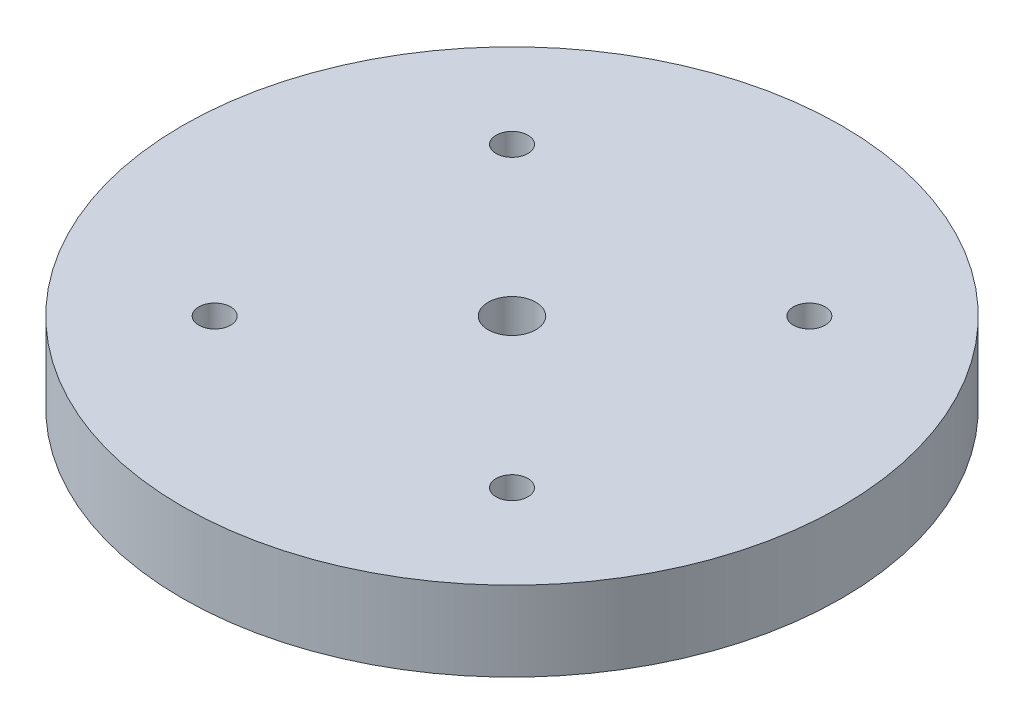
ISO-10303-21;
HEADER;
FILE_DESCRIPTION(('STEP AP214'),'2;1');
FILE_NAME('part.step','',(''),(''),'','','');
FILE_SCHEMA(('AUTOMOTIVE_DESIGN { 1 0 10303 214 1 1 1 1 }'));
ENDSEC;
DATA;
#1=APPLICATION_CONTEXT('core data for automotive mechanical design processes');
#2=APPLICATION_PROTOCOL_DEFINITION('international standard','automotive_design',2000,#1);
#3=PRODUCT_CONTEXT('',#1,'mechanical');
#4=PRODUCT('Part','Part','',(#3));
#5=PRODUCT_RELATED_PRODUCT_CATEGORY('part','',(#4));
#6=PRODUCT_DEFINITION_FORMATION('','',#4);
#7=PRODUCT_DEFINITION_CONTEXT('part definition',#1,'design');
#8=PRODUCT_DEFINITION('design','',#6,#7);
#9=PRODUCT_DEFINITION_SHAPE('','',#8);
#10=(LENGTH_UNIT() NAMED_UNIT(*) SI_UNIT(.MILLI.,.METRE.));
#11=(NAMED_UNIT(*) PLANE_ANGLE_UNIT() SI_UNIT($,.RADIAN.));
#12=(NAMED_UNIT(*) SI_UNIT($,.STERADIAN.) SOLID_ANGLE_UNIT());
#13=UNCERTAINTY_MEASURE_WITH_UNIT(LENGTH_MEASURE(1.E-05),#10,'distance_accuracy_value','');
#14=(GEOMETRIC_REPRESENTATION_CONTEXT(3) GLOBAL_UNCERTAINTY_ASSIGNED_CONTEXT((#13)) GLOBAL_UNIT_ASSIGNED_CONTEXT((#10,
#11,#12)) REPRESENTATION_CONTEXT('',''));
#15=CARTESIAN_POINT('',(0.,0.,0.));
#16=DIRECTION('',(0.,0.,1.));
#17=DIRECTION('',(1.,0.,0.));
#18=AXIS2_PLACEMENT_3D('',#15,#16,#17);
#19=CARTESIAN_POINT('',(0.,-206.,0.));
#20=DIRECTION('',(0.,1.,0.));
#21=DIRECTION('',(0.,0.,1.));
#22=AXIS2_PLACEMENT_3D('',#19,#20,#21);
#23=PLANE('',#22);
#24=CARTESIAN_POINT('',(-5.6,-206.,5.6));
#25=DIRECTION('',(0.,1.,0.));
#26=DIRECTION('',(0.,0.,1.));
#27=AXIS2_PLACEMENT_3D('',#24,#25,#26);
#28=CIRCLE('',#27,0.6);
#29=CARTESIAN_POINT('',(-5.6,-206.,6.2));
#30=VERTEX_POINT('',#29);
#31=EDGE_CURVE('E59',#30,#30,#28,.T.);
#32=ORIENTED_EDGE('',*,*,#31,.F.);
#33=EDGE_LOOP('',(#32));
#34=FACE_BOUND('',#33,.T.);
#35=CARTESIAN_POINT('',(5.6,-206.,-5.6));
#36=DIRECTION('',(0.,1.,0.));
#37=DIRECTION('',(0.,0.,1.));
#38=AXIS2_PLACEMENT_3D('',#35,#36,#37);
#39=CIRCLE('',#38,0.6);
#40=CARTESIAN_POINT('',(5.6,-206.,-5.));
#41=VERTEX_POINT('',#40);
#42=EDGE_CURVE('E47',#41,#41,#39,.T.);
#43=ORIENTED_EDGE('',*,*,#42,.F.);
#44=EDGE_LOOP('',(#43));
#45=FACE_BOUND('',#44,.T.);
#46=CARTESIAN_POINT('',(0.,-206.,0.));
#47=DIRECTION('',(0.,1.,0.));
#48=DIRECTION('',(0.,0.,1.));
#49=AXIS2_PLACEMENT_3D('',#46,#47,#48);
#50=CIRCLE('',#49,12.4195959492893);
#51=CARTESIAN_POINT('',(0.,-206.,12.4195959492893));
#52=VERTEX_POINT('',#51);
#53=EDGE_CURVE('E10',#52,#52,#50,.T.);
#54=ORIENTED_EDGE('',*,*,#53,.T.);
#55=EDGE_LOOP('',(#54));
#56=FACE_BOUND('',#55,.T.);
#57=CARTESIAN_POINT('',(0.,-206.,0.));
#58=DIRECTION('',(0.,1.,0.));
#59=DIRECTION('',(0.,0.,1.));
#60=AXIS2_PLACEMENT_3D('',#57,#58,#59);
#61=CIRCLE('',#60,0.9);
#62=CARTESIAN_POINT('',(0.,-206.,0.9));
#63=VERTEX_POINT('',#62);
#64=EDGE_CURVE('E42',#63,#63,#61,.T.);
#65=ORIENTED_EDGE('',*,*,#64,.F.);
#66=EDGE_LOOP('',(#65));
#67=FACE_BOUND('',#66,.T.);
#68=CARTESIAN_POINT('',(-5.6,-206.,-5.6));
#69=DIRECTION('',(0.,1.,0.));
#70=DIRECTION('',(0.,0.,1.));
#71=AXIS2_PLACEMENT_3D('',#68,#69,#70);
#72=CIRCLE('',#71,0.6);
#73=CARTESIAN_POINT('',(-5.6,-206.,-5.));
#74=VERTEX_POINT('',#73);
#75=EDGE_CURVE('E53',#74,#74,#72,.T.);
#76=ORIENTED_EDGE('',*,*,#75,.F.);
#77=EDGE_LOOP('',(#76));
#78=FACE_BOUND('',#77,.T.);
#79=CARTESIAN_POINT('',(5.6,-206.,5.6));
#80=DIRECTION('',(0.,1.,0.));
#81=DIRECTION('',(0.,0.,1.));
#82=AXIS2_PLACEMENT_3D('',#79,#80,#81);
#83=CIRCLE('',#82,0.6);
#84=CARTESIAN_POINT('',(5.6,-206.,6.2));
#85=VERTEX_POINT('',#84);
#86=EDGE_CURVE('E65',#85,#85,#83,.T.);
#87=ORIENTED_EDGE('',*,*,#86,.F.);
#88=EDGE_LOOP('',(#87));
#89=FACE_BOUND('',#88,.T.);
#90=ADVANCED_FACE('F31',(#34,#45,#56,#67,#78,#89),#23,.T.);
#91=CARTESIAN_POINT('',(0.,-209.,0.));
#92=DIRECTION('',(0.,1.,0.));
#93=DIRECTION('',(0.,0.,1.));
#94=AXIS2_PLACEMENT_3D('',#91,#92,#93);
#95=PLANE('',#94);
#96=CARTESIAN_POINT('',(0.,-209.,0.));
#97=DIRECTION('',(0.,-1.,0.));
#98=DIRECTION('',(0.,0.,-1.));
#99=AXIS2_PLACEMENT_3D('',#96,#97,#98);
#100=CIRCLE('',#99,3.);
#101=CARTESIAN_POINT('',(0.,-209.,-3.));
#102=VERTEX_POINT('',#101);
#103=EDGE_CURVE('E71',#102,#102,#100,.T.);
#104=ORIENTED_EDGE('',*,*,#103,.F.);
#105=EDGE_LOOP('',(#104));
#106=FACE_BOUND('',#105,.T.);
#107=CARTESIAN_POINT('',(0.,-209.,0.));
#108=DIRECTION('',(0.,1.,0.));
#109=DIRECTION('',(0.,0.,1.));
#110=AXIS2_PLACEMENT_3D('',#107,#108,#109);
#111=CIRCLE('',#110,12.4195959492893);
#112=CARTESIAN_POINT('',(0.,-209.,12.4195959492893));
#113=VERTEX_POINT('',#112);
#114=EDGE_CURVE('E35',#113,#113,#111,.T.);
#115=ORIENTED_EDGE('',*,*,#114,.F.);
#116=EDGE_LOOP('',(#115));
#117=FACE_BOUND('',#116,.T.);
#118=CARTESIAN_POINT('',(5.6,-209.,-5.6));
#119=DIRECTION('',(0.,1.,0.));
#120=DIRECTION('',(0.,0.,1.));
#121=AXIS2_PLACEMENT_3D('',#118,#119,#120);
#122=CIRCLE('',#121,0.6);
#123=CARTESIAN_POINT('',(5.6,-209.,-5.));
#124=VERTEX_POINT('',#123);
#125=EDGE_CURVE('E50',#124,#124,#122,.T.);
#126=ORIENTED_EDGE('',*,*,#125,.T.);
#127=EDGE_LOOP('',(#126));
#128=FACE_BOUND('',#127,.T.);
#129=CARTESIAN_POINT('',(-5.6,-209.,-5.6));
#130=DIRECTION('',(0.,1.,0.));
#131=DIRECTION('',(0.,0.,1.));
#132=AXIS2_PLACEMENT_3D('',#129,#130,#131);
#133=CIRCLE('',#132,0.6);
#134=CARTESIAN_POINT('',(-5.6,-209.,-5.));
#135=VERTEX_POINT('',#134);
#136=EDGE_CURVE('E56',#135,#135,#133,.T.);
#137=ORIENTED_EDGE('',*,*,#136,.T.);
#138=EDGE_LOOP('',(#137));
#139=FACE_BOUND('',#138,.T.);
#140=CARTESIAN_POINT('',(-5.6,-209.,5.6));
#141=DIRECTION('',(0.,1.,0.));
#142=DIRECTION('',(0.,0.,1.));
#143=AXIS2_PLACEMENT_3D('',#140,#141,#142);
#144=CIRCLE('',#143,0.6);
#145=CARTESIAN_POINT('',(-5.6,-209.,6.2));
#146=VERTEX_POINT('',#145);
#147=EDGE_CURVE('E62',#146,#146,#144,.T.);
#148=ORIENTED_EDGE('',*,*,#147,.T.);
#149=EDGE_LOOP('',(#148));
#150=FACE_BOUND('',#149,.T.);
#151=CARTESIAN_POINT('',(5.6,-209.,5.6));
#152=DIRECTION('',(0.,1.,0.));
#153=DIRECTION('',(0.,0.,1.));
#154=AXIS2_PLACEMENT_3D('',#151,#152,#153);
#155=CIRCLE('',#154,0.6);
#156=CARTESIAN_POINT('',(5.6,-209.,6.2));
#157=VERTEX_POINT('',#156);
#158=EDGE_CURVE('E68',#157,#157,#155,.T.);
#159=ORIENTED_EDGE('',*,*,#158,.T.);
#160=EDGE_LOOP('',(#159));
#161=FACE_BOUND('',#160,.T.);
#162=ADVANCED_FACE('F96',(#106,#117,#128,#139,#150,#161),#95,.F.);
#163=CARTESIAN_POINT('',(0.,-206.,0.));
#164=DIRECTION('',(0.,-1.,0.));
#165=DIRECTION('',(0.,0.,-1.));
#166=AXIS2_PLACEMENT_3D('',#163,#164,#165);
#167=CYLINDRICAL_SURFACE('',#166,12.4195959492893);
#168=ORIENTED_EDGE('',*,*,#53,.F.);
#169=EDGE_LOOP('',(#168));
#170=FACE_BOUND('',#169,.T.);
#171=ORIENTED_EDGE('',*,*,#114,.T.);
#172=EDGE_LOOP('',(#171));
#173=FACE_BOUND('',#172,.T.);
#174=ADVANCED_FACE('F33',(#170,#173),#167,.T.);
#175=CARTESIAN_POINT('',(0.,-206.,0.));
#176=DIRECTION('',(0.,-1.,0.));
#177=DIRECTION('',(0.,0.,-1.));
#178=AXIS2_PLACEMENT_3D('',#175,#176,#177);
#179=CYLINDRICAL_SURFACE('',#178,0.9);
#180=ORIENTED_EDGE('',*,*,#64,.T.);
#181=EDGE_LOOP('',(#180));
#182=FACE_BOUND('',#181,.T.);
#183=CARTESIAN_POINT('',(0.,-209.,0.));
#184=DIRECTION('',(0.,1.,0.));
#185=DIRECTION('',(0.,0.,1.));
#186=AXIS2_PLACEMENT_3D('',#183,#184,#185);
#187=CIRCLE('',#186,0.9);
#188=CARTESIAN_POINT('',(0.,-209.,0.9));
#189=VERTEX_POINT('',#188);
#190=EDGE_CURVE('E44',#189,#189,#187,.T.);
#191=ORIENTED_EDGE('',*,*,#190,.F.);
#192=EDGE_LOOP('',(#191));
#193=FACE_BOUND('',#192,.T.);
#194=ADVANCED_FACE('F106',(#182,#193),#179,.F.);
#195=CARTESIAN_POINT('',(5.6,-206.,-5.6));
#196=DIRECTION('',(0.,-1.,0.));
#197=DIRECTION('',(0.,0.,-1.));
#198=AXIS2_PLACEMENT_3D('',#195,#196,#197);
#199=CYLINDRICAL_SURFACE('',#198,0.6);
#200=ORIENTED_EDGE('',*,*,#42,.T.);
#201=EDGE_LOOP('',(#200));
#202=FACE_BOUND('',#201,.T.);
#203=ORIENTED_EDGE('',*,*,#125,.F.);
#204=EDGE_LOOP('',(#203));
#205=FACE_BOUND('',#204,.T.);
#206=ADVANCED_FACE('F109',(#202,#205),#199,.F.);
#207=CARTESIAN_POINT('',(-5.6,-206.,-5.6));
#208=DIRECTION('',(0.,-1.,0.));
#209=DIRECTION('',(0.,0.,-1.));
#210=AXIS2_PLACEMENT_3D('',#207,#208,#209);
#211=CYLINDRICAL_SURFACE('',#210,0.6);
#212=ORIENTED_EDGE('',*,*,#75,.T.);
#213=EDGE_LOOP('',(#212));
#214=FACE_BOUND('',#213,.T.);
#215=ORIENTED_EDGE('',*,*,#136,.F.);
#216=EDGE_LOOP('',(#215));
#217=FACE_BOUND('',#216,.T.);
#218=ADVANCED_FACE('F113',(#214,#217),#211,.F.);
#219=CARTESIAN_POINT('',(-5.6,-206.,5.6));
#220=DIRECTION('',(0.,-1.,0.));
#221=DIRECTION('',(0.,0.,-1.));
#222=AXIS2_PLACEMENT_3D('',#219,#220,#221);
#223=CYLINDRICAL_SURFACE('',#222,0.6);
#224=ORIENTED_EDGE('',*,*,#31,.T.);
#225=EDGE_LOOP('',(#224));
#226=FACE_BOUND('',#225,.T.);
#227=ORIENTED_EDGE('',*,*,#147,.F.);
#228=EDGE_LOOP('',(#227));
#229=FACE_BOUND('',#228,.T.);
#230=ADVANCED_FACE('F117',(#226,#229),#223,.F.);
#231=CARTESIAN_POINT('',(5.6,-206.,5.6));
#232=DIRECTION('',(0.,-1.,0.));
#233=DIRECTION('',(0.,0.,-1.));
#234=AXIS2_PLACEMENT_3D('',#231,#232,#233);
#235=CYLINDRICAL_SURFACE('',#234,0.6);
#236=ORIENTED_EDGE('',*,*,#86,.T.);
#237=EDGE_LOOP('',(#236));
#238=FACE_BOUND('',#237,.T.);
#239=ORIENTED_EDGE('',*,*,#158,.F.);
#240=EDGE_LOOP('',(#239));
#241=FACE_BOUND('',#240,.T.);
#242=ADVANCED_FACE('F92',(#238,#241),#235,.F.);
#243=CARTESIAN_POINT('',(0.,-209.,0.));
#244=DIRECTION('',(0.,1.,0.));
#245=DIRECTION('',(0.,0.,1.));
#246=AXIS2_PLACEMENT_3D('',#243,#244,#245);
#247=PLANE('',#246);
#248=ORIENTED_EDGE('',*,*,#190,.T.);
#249=EDGE_LOOP('',(#248));
#250=FACE_BOUND('',#249,.T.);
#251=ADVANCED_FACE('F84',(#250),#247,.T.);
#252=CARTESIAN_POINT('',(0.,-219.,0.));
#253=DIRECTION('',(0.,-1.,0.));
#254=DIRECTION('',(0.,0.,-1.));
#255=AXIS2_PLACEMENT_3D('',#252,#253,#254);
#256=CYLINDRICAL_SURFACE('',#255,3.);
#257=ORIENTED_EDGE('',*,*,#103,.T.);
#258=EDGE_LOOP('',(#257));
#259=FACE_BOUND('',#258,.T.);
#260=CARTESIAN_POINT('',(0.,-215.,0.));
#261=DIRECTION('',(0.,-1.,0.));
#262=DIRECTION('',(0.,0.,-1.));
#263=AXIS2_PLACEMENT_3D('',#260,#261,#262);
#264=CIRCLE('',#263,3.);
#265=CARTESIAN_POINT('',(0.,-215.,-3.));
#266=VERTEX_POINT('',#265);
#267=EDGE_CURVE('E76',#266,#266,#264,.T.);
#268=ORIENTED_EDGE('',*,*,#267,.F.);
#269=EDGE_LOOP('',(#268));
#270=FACE_BOUND('',#269,.T.);
#271=ADVANCED_FACE('F82',(#259,#270),#256,.T.);
#272=CARTESIAN_POINT('',(1.2,-215.,0.));
#273=DIRECTION('',(0.,-1.,0.));
#274=DIRECTION('',(0.,0.,-1.));
#275=AXIS2_PLACEMENT_3D('',#272,#273,#274);
#276=PLANE('',#275);
#277=ORIENTED_EDGE('',*,*,#267,.T.);
#278=EDGE_LOOP('',(#277));
#279=FACE_BOUND('',#278,.T.);
#280=ADVANCED_FACE('F80',(#279),#276,.T.);
#281=CLOSED_SHELL('',(#90,#162,#174,#194,#206,#218,#230,#242,#251,#271,#280));
#282=MANIFOLD_SOLID_BREP('B2',#281);
#283=ADVANCED_BREP_SHAPE_REPRESENTATION('',(#18,#282),#14);
#284=SHAPE_DEFINITION_REPRESENTATION(#9,#283);
ENDSEC;
END-ISO-10303-21;
